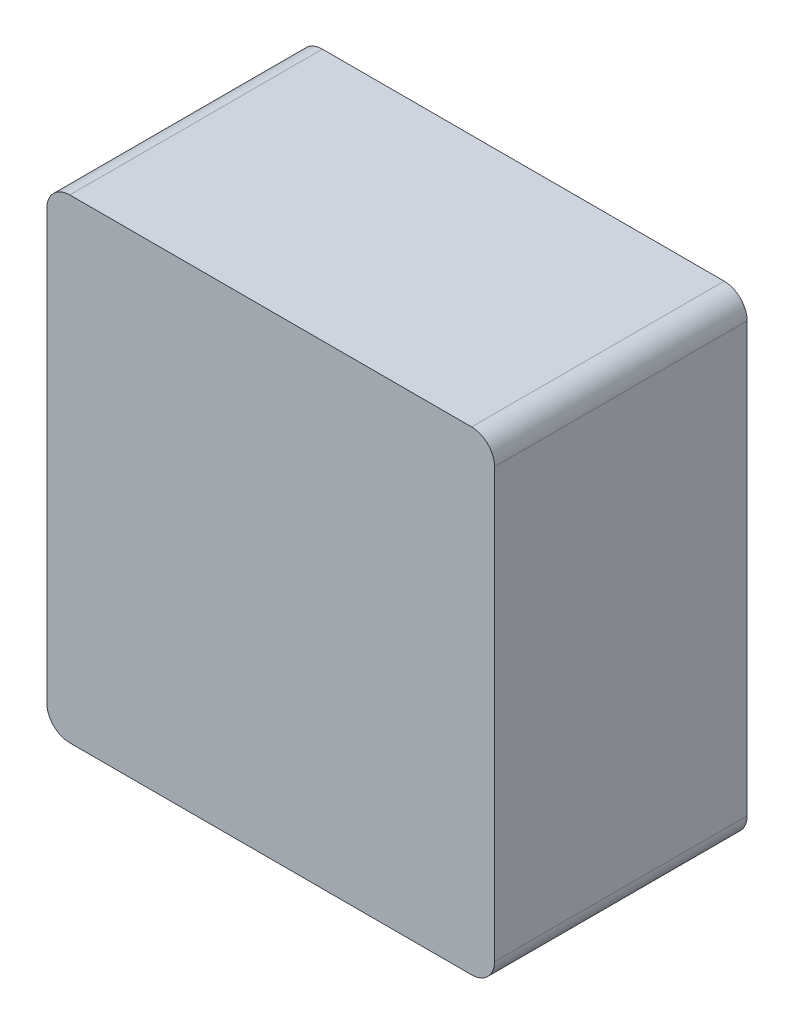
ISO-10303-21;
HEADER;
FILE_DESCRIPTION(('STEP AP214'),'2;1');
FILE_NAME('part.step','',(''),(''),'','','');
FILE_SCHEMA(('AUTOMOTIVE_DESIGN { 1 0 10303 214 1 1 1 1 }'));
ENDSEC;
DATA;
#1=APPLICATION_CONTEXT('core data for automotive mechanical design processes');
#2=APPLICATION_PROTOCOL_DEFINITION('international standard','automotive_design',2000,#1);
#3=PRODUCT_CONTEXT('',#1,'mechanical');
#4=PRODUCT('Part','Part','',(#3));
#5=PRODUCT_RELATED_PRODUCT_CATEGORY('part','',(#4));
#6=PRODUCT_DEFINITION_FORMATION('','',#4);
#7=PRODUCT_DEFINITION_CONTEXT('part definition',#1,'design');
#8=PRODUCT_DEFINITION('design','',#6,#7);
#9=PRODUCT_DEFINITION_SHAPE('','',#8);
#10=(LENGTH_UNIT() NAMED_UNIT(*) SI_UNIT(.MILLI.,.METRE.));
#11=(NAMED_UNIT(*) PLANE_ANGLE_UNIT() SI_UNIT($,.RADIAN.));
#12=(NAMED_UNIT(*) SI_UNIT($,.STERADIAN.) SOLID_ANGLE_UNIT());
#13=UNCERTAINTY_MEASURE_WITH_UNIT(LENGTH_MEASURE(1.E-05),#10,'distance_accuracy_value','');
#14=(GEOMETRIC_REPRESENTATION_CONTEXT(3) GLOBAL_UNCERTAINTY_ASSIGNED_CONTEXT((#13)) GLOBAL_UNIT_ASSIGNED_CONTEXT((#10,
#11,#12)) REPRESENTATION_CONTEXT('',''));
#15=CARTESIAN_POINT('',(0.,0.,0.));
#16=DIRECTION('',(0.,0.,1.));
#17=DIRECTION('',(1.,0.,0.));
#18=AXIS2_PLACEMENT_3D('',#15,#16,#17);
#19=CARTESIAN_POINT('',(26.25,-28.,-7.));
#20=DIRECTION('',(0.,0.,1.));
#21=DIRECTION('',(1.,0.,0.));
#22=AXIS2_PLACEMENT_3D('',#19,#20,#21);
#23=PLANE('',#22);
#24=CARTESIAN_POINT('',(26.25,-28.,-7.));
#25=DIRECTION('',(0.,0.,1.));
#26=DIRECTION('',(1.,0.,0.));
#27=AXIS2_PLACEMENT_3D('',#24,#25,#26);
#28=CIRCLE('',#27,3.);
#29=CARTESIAN_POINT('',(26.25,-31.,-7.));
#30=VERTEX_POINT('',#29);
#31=CARTESIAN_POINT('',(29.25,-28.,-7.));
#32=VERTEX_POINT('',#31);
#33=EDGE_CURVE('E143',#30,#32,#28,.T.);
#34=ORIENTED_EDGE('',*,*,#33,.F.);
#35=DIRECTION('',(1.,0.,0.));
#36=VECTOR('',#35,1.);
#37=CARTESIAN_POINT('',(-26.25,-31.,-7.));
#38=LINE('',#37,#36);
#39=CARTESIAN_POINT('',(-26.25,-31.,-7.));
#40=VERTEX_POINT('',#39);
#41=EDGE_CURVE('E212',#40,#30,#38,.T.);
#42=ORIENTED_EDGE('',*,*,#41,.F.);
#43=CARTESIAN_POINT('',(-26.25,-28.,-7.));
#44=DIRECTION('',(0.,0.,1.));
#45=DIRECTION('',(1.,0.,0.));
#46=AXIS2_PLACEMENT_3D('',#43,#44,#45);
#47=CIRCLE('',#46,3.);
#48=CARTESIAN_POINT('',(-29.25,-28.,-7.));
#49=VERTEX_POINT('',#48);
#50=EDGE_CURVE('E210',#49,#40,#47,.T.);
#51=ORIENTED_EDGE('',*,*,#50,.F.);
#52=DIRECTION('',(0.,-1.,0.));
#53=VECTOR('',#52,1.);
#54=CARTESIAN_POINT('',(-29.25,28.,-7.));
#55=LINE('',#54,#53);
#56=CARTESIAN_POINT('',(-29.25,28.,-7.));
#57=VERTEX_POINT('',#56);
#58=EDGE_CURVE('E208',#57,#49,#55,.T.);
#59=ORIENTED_EDGE('',*,*,#58,.F.);
#60=CARTESIAN_POINT('',(-26.25,28.,-7.));
#61=DIRECTION('',(0.,0.,1.));
#62=DIRECTION('',(1.,0.,0.));
#63=AXIS2_PLACEMENT_3D('',#60,#61,#62);
#64=CIRCLE('',#63,3.);
#65=CARTESIAN_POINT('',(-26.25,31.,-7.));
#66=VERTEX_POINT('',#65);
#67=EDGE_CURVE('E206',#66,#57,#64,.T.);
#68=ORIENTED_EDGE('',*,*,#67,.F.);
#69=DIRECTION('',(-1.,0.,0.));
#70=VECTOR('',#69,1.);
#71=CARTESIAN_POINT('',(26.25,31.,-7.));
#72=LINE('',#71,#70);
#73=CARTESIAN_POINT('',(26.25,31.,-7.));
#74=VERTEX_POINT('',#73);
#75=EDGE_CURVE('E204',#74,#66,#72,.T.);
#76=ORIENTED_EDGE('',*,*,#75,.F.);
#77=CARTESIAN_POINT('',(26.25,28.,-7.));
#78=DIRECTION('',(0.,0.,1.));
#79=DIRECTION('',(1.,0.,0.));
#80=AXIS2_PLACEMENT_3D('',#77,#78,#79);
#81=CIRCLE('',#80,3.);
#82=CARTESIAN_POINT('',(29.25,28.,-7.));
#83=VERTEX_POINT('',#82);
#84=EDGE_CURVE('E202',#83,#74,#81,.T.);
#85=ORIENTED_EDGE('',*,*,#84,.F.);
#86=DIRECTION('',(0.,1.,0.));
#87=VECTOR('',#86,1.);
#88=CARTESIAN_POINT('',(29.25,-28.,-7.));
#89=LINE('',#88,#87);
#90=EDGE_CURVE('E200',#32,#83,#89,.T.);
#91=ORIENTED_EDGE('',*,*,#90,.F.);
#92=EDGE_LOOP('',(#34,#42,#51,#59,#68,#76,#85,#91));
#93=FACE_BOUND('',#92,.T.);
#94=DIRECTION('',(-1.,0.,0.));
#95=VECTOR('',#94,1.);
#96=CARTESIAN_POINT('',(27.15,28.9,-7.));
#97=LINE('',#96,#95);
#98=CARTESIAN_POINT('',(27.15,28.9,-7.));
#99=VERTEX_POINT('',#98);
#100=CARTESIAN_POINT('',(-27.15,28.9,-7.));
#101=VERTEX_POINT('',#100);
#102=EDGE_CURVE('E179',#99,#101,#97,.T.);
#103=ORIENTED_EDGE('',*,*,#102,.T.);
#104=DIRECTION('',(0.,-1.,0.));
#105=VECTOR('',#104,1.);
#106=CARTESIAN_POINT('',(-27.15,28.9,-7.));
#107=LINE('',#106,#105);
#108=CARTESIAN_POINT('',(-27.15,-28.9,-7.));
#109=VERTEX_POINT('',#108);
#110=EDGE_CURVE('E182',#101,#109,#107,.T.);
#111=ORIENTED_EDGE('',*,*,#110,.T.);
#112=DIRECTION('',(1.,0.,0.));
#113=VECTOR('',#112,1.);
#114=CARTESIAN_POINT('',(-27.15,-28.9,-7.));
#115=LINE('',#114,#113);
#116=CARTESIAN_POINT('',(27.15,-28.9,-7.));
#117=VERTEX_POINT('',#116);
#118=EDGE_CURVE('E185',#109,#117,#115,.T.);
#119=ORIENTED_EDGE('',*,*,#118,.T.);
#120=DIRECTION('',(0.,1.,0.));
#121=VECTOR('',#120,1.);
#122=CARTESIAN_POINT('',(27.15,-28.9,-7.));
#123=LINE('',#122,#121);
#124=EDGE_CURVE('E188',#117,#99,#123,.T.);
#125=ORIENTED_EDGE('',*,*,#124,.T.);
#126=EDGE_LOOP('',(#103,#111,#119,#125));
#127=FACE_BOUND('',#126,.T.);
#128=ADVANCED_FACE('F33',(#93,#127),#23,.F.);
#129=CARTESIAN_POINT('',(26.25,-28.,23.));
#130=DIRECTION('',(0.,0.,-1.));
#131=DIRECTION('',(-1.,0.,0.));
#132=AXIS2_PLACEMENT_3D('',#129,#130,#131);
#133=CYLINDRICAL_SURFACE('',#132,3.);
#134=ORIENTED_EDGE('',*,*,#33,.T.);
#135=DIRECTION('',(0.,0.,-1.));
#136=VECTOR('',#135,1.);
#137=CARTESIAN_POINT('',(29.25,-28.,23.));
#138=LINE('',#137,#136);
#139=CARTESIAN_POINT('',(29.25,-28.,26.));
#140=VERTEX_POINT('',#139);
#141=EDGE_CURVE('E136',#140,#32,#138,.T.);
#142=ORIENTED_EDGE('',*,*,#141,.F.);
#143=CARTESIAN_POINT('',(26.25,-28.,26.));
#144=DIRECTION('',(0.,0.,1.));
#145=DIRECTION('',(1.,0.,0.));
#146=AXIS2_PLACEMENT_3D('',#143,#144,#145);
#147=CIRCLE('',#146,3.);
#148=CARTESIAN_POINT('',(26.25,-31.,26.));
#149=VERTEX_POINT('',#148);
#150=EDGE_CURVE('E141',#149,#140,#147,.T.);
#151=ORIENTED_EDGE('',*,*,#150,.F.);
#152=DIRECTION('',(0.,0.,-1.));
#153=VECTOR('',#152,1.);
#154=CARTESIAN_POINT('',(26.25,-31.,23.));
#155=LINE('',#154,#153);
#156=EDGE_CURVE('E214',#149,#30,#155,.T.);
#157=ORIENTED_EDGE('',*,*,#156,.T.);
#158=EDGE_LOOP('',(#134,#142,#151,#157));
#159=FACE_BOUND('',#158,.T.);
#160=ADVANCED_FACE('F138',(#159),#133,.T.);
#161=CARTESIAN_POINT('',(29.25,-28.,23.));
#162=DIRECTION('',(-1.,0.,0.));
#163=DIRECTION('',(0.,-1.,0.));
#164=AXIS2_PLACEMENT_3D('',#161,#162,#163);
#165=PLANE('',#164);
#166=ORIENTED_EDGE('',*,*,#90,.T.);
#167=DIRECTION('',(0.,0.,-1.));
#168=VECTOR('',#167,1.);
#169=CARTESIAN_POINT('',(29.25,28.,23.));
#170=LINE('',#169,#168);
#171=CARTESIAN_POINT('',(29.25,28.,26.));
#172=VERTEX_POINT('',#171);
#173=EDGE_CURVE('E146',#172,#83,#170,.T.);
#174=ORIENTED_EDGE('',*,*,#173,.F.);
#175=DIRECTION('',(0.,1.,0.));
#176=VECTOR('',#175,1.);
#177=CARTESIAN_POINT('',(29.25,-28.,26.));
#178=LINE('',#177,#176);
#179=EDGE_CURVE('E149',#140,#172,#178,.T.);
#180=ORIENTED_EDGE('',*,*,#179,.F.);
#181=ORIENTED_EDGE('',*,*,#141,.T.);
#182=EDGE_LOOP('',(#166,#174,#180,#181));
#183=FACE_BOUND('',#182,.T.);
#184=ADVANCED_FACE('F150',(#183),#165,.F.);
#185=CARTESIAN_POINT('',(26.25,28.,23.));
#186=DIRECTION('',(0.,0.,-1.));
#187=DIRECTION('',(-1.,0.,0.));
#188=AXIS2_PLACEMENT_3D('',#185,#186,#187);
#189=CYLINDRICAL_SURFACE('',#188,3.);
#190=ORIENTED_EDGE('',*,*,#84,.T.);
#191=DIRECTION('',(0.,0.,-1.));
#192=VECTOR('',#191,1.);
#193=CARTESIAN_POINT('',(26.25,31.,23.));
#194=LINE('',#193,#192);
#195=CARTESIAN_POINT('',(26.25,31.,26.));
#196=VERTEX_POINT('',#195);
#197=EDGE_CURVE('E228',#196,#74,#194,.T.);
#198=ORIENTED_EDGE('',*,*,#197,.F.);
#199=CARTESIAN_POINT('',(26.25,28.,26.));
#200=DIRECTION('',(0.,0.,1.));
#201=DIRECTION('',(1.,0.,0.));
#202=AXIS2_PLACEMENT_3D('',#199,#200,#201);
#203=CIRCLE('',#202,3.);
#204=EDGE_CURVE('E155',#172,#196,#203,.T.);
#205=ORIENTED_EDGE('',*,*,#204,.F.);
#206=ORIENTED_EDGE('',*,*,#173,.T.);
#207=EDGE_LOOP('',(#190,#198,#205,#206));
#208=FACE_BOUND('',#207,.T.);
#209=ADVANCED_FACE('F314',(#208),#189,.T.);
#210=CARTESIAN_POINT('',(26.25,31.,23.));
#211=DIRECTION('',(0.,-1.,0.));
#212=DIRECTION('',(0.,0.,-1.));
#213=AXIS2_PLACEMENT_3D('',#210,#211,#212);
#214=PLANE('',#213);
#215=ORIENTED_EDGE('',*,*,#75,.T.);
#216=DIRECTION('',(0.,0.,-1.));
#217=VECTOR('',#216,1.);
#218=CARTESIAN_POINT('',(-26.25,31.,23.));
#219=LINE('',#218,#217);
#220=CARTESIAN_POINT('',(-26.25,31.,26.));
#221=VERTEX_POINT('',#220);
#222=EDGE_CURVE('E225',#221,#66,#219,.T.);
#223=ORIENTED_EDGE('',*,*,#222,.F.);
#224=DIRECTION('',(-1.,0.,0.));
#225=VECTOR('',#224,1.);
#226=CARTESIAN_POINT('',(26.25,31.,26.));
#227=LINE('',#226,#225);
#228=EDGE_CURVE('E167',#196,#221,#227,.T.);
#229=ORIENTED_EDGE('',*,*,#228,.F.);
#230=ORIENTED_EDGE('',*,*,#197,.T.);
#231=EDGE_LOOP('',(#215,#223,#229,#230));
#232=FACE_BOUND('',#231,.T.);
#233=ADVANCED_FACE('F310',(#232),#214,.F.);
#234=CARTESIAN_POINT('',(-26.25,28.,23.));
#235=DIRECTION('',(0.,0.,-1.));
#236=DIRECTION('',(-1.,0.,0.));
#237=AXIS2_PLACEMENT_3D('',#234,#235,#236);
#238=CYLINDRICAL_SURFACE('',#237,3.);
#239=ORIENTED_EDGE('',*,*,#67,.T.);
#240=DIRECTION('',(0.,0.,-1.));
#241=VECTOR('',#240,1.);
#242=CARTESIAN_POINT('',(-29.25,28.,23.));
#243=LINE('',#242,#241);
#244=CARTESIAN_POINT('',(-29.25,28.,26.));
#245=VERTEX_POINT('',#244);
#246=EDGE_CURVE('E222',#245,#57,#243,.T.);
#247=ORIENTED_EDGE('',*,*,#246,.F.);
#248=CARTESIAN_POINT('',(-26.25,28.,26.));
#249=DIRECTION('',(0.,0.,1.));
#250=DIRECTION('',(1.,0.,0.));
#251=AXIS2_PLACEMENT_3D('',#248,#249,#250);
#252=CIRCLE('',#251,3.);
#253=EDGE_CURVE('E170',#221,#245,#252,.T.);
#254=ORIENTED_EDGE('',*,*,#253,.F.);
#255=ORIENTED_EDGE('',*,*,#222,.T.);
#256=EDGE_LOOP('',(#239,#247,#254,#255));
#257=FACE_BOUND('',#256,.T.);
#258=ADVANCED_FACE('F306',(#257),#238,.T.);
#259=CARTESIAN_POINT('',(-29.25,28.,23.));
#260=DIRECTION('',(1.,0.,0.));
#261=DIRECTION('',(0.,1.,0.));
#262=AXIS2_PLACEMENT_3D('',#259,#260,#261);
#263=PLANE('',#262);
#264=ORIENTED_EDGE('',*,*,#58,.T.);
#265=DIRECTION('',(0.,0.,-1.));
#266=VECTOR('',#265,1.);
#267=CARTESIAN_POINT('',(-29.25,-28.,23.));
#268=LINE('',#267,#266);
#269=CARTESIAN_POINT('',(-29.25,-28.,26.));
#270=VERTEX_POINT('',#269);
#271=EDGE_CURVE('E219',#270,#49,#268,.T.);
#272=ORIENTED_EDGE('',*,*,#271,.F.);
#273=DIRECTION('',(0.,-1.,0.));
#274=VECTOR('',#273,1.);
#275=CARTESIAN_POINT('',(-29.25,28.,26.));
#276=LINE('',#275,#274);
#277=EDGE_CURVE('E173',#245,#270,#276,.T.);
#278=ORIENTED_EDGE('',*,*,#277,.F.);
#279=ORIENTED_EDGE('',*,*,#246,.T.);
#280=EDGE_LOOP('',(#264,#272,#278,#279));
#281=FACE_BOUND('',#280,.T.);
#282=ADVANCED_FACE('F302',(#281),#263,.F.);
#283=CARTESIAN_POINT('',(-26.25,-28.,23.));
#284=DIRECTION('',(0.,0.,-1.));
#285=DIRECTION('',(-1.,0.,0.));
#286=AXIS2_PLACEMENT_3D('',#283,#284,#285);
#287=CYLINDRICAL_SURFACE('',#286,3.);
#288=ORIENTED_EDGE('',*,*,#50,.T.);
#289=DIRECTION('',(0.,0.,-1.));
#290=VECTOR('',#289,1.);
#291=CARTESIAN_POINT('',(-26.25,-31.,23.));
#292=LINE('',#291,#290);
#293=CARTESIAN_POINT('',(-26.25,-31.,26.));
#294=VERTEX_POINT('',#293);
#295=EDGE_CURVE('E216',#294,#40,#292,.T.);
#296=ORIENTED_EDGE('',*,*,#295,.F.);
#297=CARTESIAN_POINT('',(-26.25,-28.,26.));
#298=DIRECTION('',(0.,0.,1.));
#299=DIRECTION('',(1.,0.,0.));
#300=AXIS2_PLACEMENT_3D('',#297,#298,#299);
#301=CIRCLE('',#300,3.);
#302=EDGE_CURVE('E176',#270,#294,#301,.T.);
#303=ORIENTED_EDGE('',*,*,#302,.F.);
#304=ORIENTED_EDGE('',*,*,#271,.T.);
#305=EDGE_LOOP('',(#288,#296,#303,#304));
#306=FACE_BOUND('',#305,.T.);
#307=ADVANCED_FACE('F298',(#306),#287,.T.);
#308=CARTESIAN_POINT('',(-26.25,-31.,23.));
#309=DIRECTION('',(0.,1.,0.));
#310=DIRECTION('',(0.,0.,1.));
#311=AXIS2_PLACEMENT_3D('',#308,#309,#310);
#312=PLANE('',#311);
#313=ORIENTED_EDGE('',*,*,#41,.T.);
#314=ORIENTED_EDGE('',*,*,#156,.F.);
#315=DIRECTION('',(1.,0.,0.));
#316=VECTOR('',#315,1.);
#317=CARTESIAN_POINT('',(-26.25,-31.,26.));
#318=LINE('',#317,#316);
#319=EDGE_CURVE('E161',#294,#149,#318,.T.);
#320=ORIENTED_EDGE('',*,*,#319,.F.);
#321=ORIENTED_EDGE('',*,*,#295,.T.);
#322=EDGE_LOOP('',(#313,#314,#320,#321));
#323=FACE_BOUND('',#322,.T.);
#324=ADVANCED_FACE('F295',(#323),#312,.F.);
#325=CARTESIAN_POINT('',(27.15,28.9,23.));
#326=DIRECTION('',(0.,-1.,0.));
#327=DIRECTION('',(0.,0.,-1.));
#328=AXIS2_PLACEMENT_3D('',#325,#326,#327);
#329=PLANE('',#328);
#330=DIRECTION('',(0.,0.,-1.));
#331=VECTOR('',#330,1.);
#332=CARTESIAN_POINT('',(27.15,28.9,23.));
#333=LINE('',#332,#331);
#334=CARTESIAN_POINT('',(27.15,28.9,20.5));
#335=VERTEX_POINT('',#334);
#336=EDGE_CURVE('E191',#335,#99,#333,.T.);
#337=ORIENTED_EDGE('',*,*,#336,.F.);
#338=DIRECTION('',(-1.,0.,0.));
#339=VECTOR('',#338,1.);
#340=CARTESIAN_POINT('',(27.15,28.9,20.5));
#341=LINE('',#340,#339);
#342=CARTESIAN_POINT('',(-27.15,28.9,20.5));
#343=VERTEX_POINT('',#342);
#344=EDGE_CURVE('E42',#335,#343,#341,.T.);
#345=ORIENTED_EDGE('',*,*,#344,.T.);
#346=DIRECTION('',(0.,0.,-1.));
#347=VECTOR('',#346,1.);
#348=CARTESIAN_POINT('',(-27.15,28.9,23.));
#349=LINE('',#348,#347);
#350=EDGE_CURVE('E197',#343,#101,#349,.T.);
#351=ORIENTED_EDGE('',*,*,#350,.T.);
#352=ORIENTED_EDGE('',*,*,#102,.F.);
#353=EDGE_LOOP('',(#337,#345,#351,#352));
#354=FACE_BOUND('',#353,.T.);
#355=ADVANCED_FACE('F273',(#354),#329,.T.);
#356=CARTESIAN_POINT('',(-27.15,28.9,23.));
#357=DIRECTION('',(1.,0.,0.));
#358=DIRECTION('',(0.,1.,0.));
#359=AXIS2_PLACEMENT_3D('',#356,#357,#358);
#360=PLANE('',#359);
#361=ORIENTED_EDGE('',*,*,#350,.F.);
#362=DIRECTION('',(0.,-1.,0.));
#363=VECTOR('',#362,1.);
#364=CARTESIAN_POINT('',(-27.15,28.9,20.5));
#365=LINE('',#364,#363);
#366=CARTESIAN_POINT('',(-27.15,-28.9,20.5));
#367=VERTEX_POINT('',#366);
#368=EDGE_CURVE('E11',#343,#367,#365,.T.);
#369=ORIENTED_EDGE('',*,*,#368,.T.);
#370=DIRECTION('',(0.,0.,-1.));
#371=VECTOR('',#370,1.);
#372=CARTESIAN_POINT('',(-27.15,-28.9,23.));
#373=LINE('',#372,#371);
#374=EDGE_CURVE('E195',#367,#109,#373,.T.);
#375=ORIENTED_EDGE('',*,*,#374,.T.);
#376=ORIENTED_EDGE('',*,*,#110,.F.);
#377=EDGE_LOOP('',(#361,#369,#375,#376));
#378=FACE_BOUND('',#377,.T.);
#379=ADVANCED_FACE('F265',(#378),#360,.T.);
#380=CARTESIAN_POINT('',(-27.15,-28.9,23.));
#381=DIRECTION('',(0.,1.,0.));
#382=DIRECTION('',(0.,0.,1.));
#383=AXIS2_PLACEMENT_3D('',#380,#381,#382);
#384=PLANE('',#383);
#385=ORIENTED_EDGE('',*,*,#374,.F.);
#386=DIRECTION('',(1.,0.,0.));
#387=VECTOR('',#386,1.);
#388=CARTESIAN_POINT('',(-27.15,-28.9,20.5));
#389=LINE('',#388,#387);
#390=CARTESIAN_POINT('',(27.15,-28.9,20.5));
#391=VERTEX_POINT('',#390);
#392=EDGE_CURVE('E145',#367,#391,#389,.T.);
#393=ORIENTED_EDGE('',*,*,#392,.T.);
#394=DIRECTION('',(0.,0.,-1.));
#395=VECTOR('',#394,1.);
#396=CARTESIAN_POINT('',(27.15,-28.9,23.));
#397=LINE('',#396,#395);
#398=EDGE_CURVE('E193',#391,#117,#397,.T.);
#399=ORIENTED_EDGE('',*,*,#398,.T.);
#400=ORIENTED_EDGE('',*,*,#118,.F.);
#401=EDGE_LOOP('',(#385,#393,#399,#400));
#402=FACE_BOUND('',#401,.T.);
#403=ADVANCED_FACE('F269',(#402),#384,.T.);
#404=CARTESIAN_POINT('',(27.15,-28.9,23.));
#405=DIRECTION('',(-1.,0.,0.));
#406=DIRECTION('',(0.,-1.,0.));
#407=AXIS2_PLACEMENT_3D('',#404,#405,#406);
#408=PLANE('',#407);
#409=ORIENTED_EDGE('',*,*,#398,.F.);
#410=DIRECTION('',(0.,1.,0.));
#411=VECTOR('',#410,1.);
#412=CARTESIAN_POINT('',(27.15,-28.9,20.5));
#413=LINE('',#412,#411);
#414=EDGE_CURVE('E57',#391,#335,#413,.T.);
#415=ORIENTED_EDGE('',*,*,#414,.T.);
#416=ORIENTED_EDGE('',*,*,#336,.T.);
#417=ORIENTED_EDGE('',*,*,#124,.F.);
#418=EDGE_LOOP('',(#409,#415,#416,#417));
#419=FACE_BOUND('',#418,.T.);
#420=ADVANCED_FACE('F274',(#419),#408,.T.);
#421=CARTESIAN_POINT('',(26.25,-28.,23.));
#422=DIRECTION('',(0.,0.,1.));
#423=DIRECTION('',(1.,0.,0.));
#424=AXIS2_PLACEMENT_3D('',#421,#422,#423);
#425=PLANE('',#424);
#426=DIRECTION('',(0.,1.,0.));
#427=VECTOR('',#426,1.);
#428=CARTESIAN_POINT('',(24.65,-28.,23.));
#429=LINE('',#428,#427);
#430=CARTESIAN_POINT('',(24.65,26.4,23.));
#431=VERTEX_POINT('',#430);
#432=CARTESIAN_POINT('',(24.65,-26.4,23.));
#433=VERTEX_POINT('',#432);
#434=EDGE_CURVE('E238',#431,#433,#429,.F.);
#435=ORIENTED_EDGE('',*,*,#434,.T.);
#436=DIRECTION('',(1.,0.,0.));
#437=VECTOR('',#436,1.);
#438=CARTESIAN_POINT('',(26.25,-26.4,23.));
#439=LINE('',#438,#437);
#440=CARTESIAN_POINT('',(-24.65,-26.4,23.));
#441=VERTEX_POINT('',#440);
#442=EDGE_CURVE('E240',#433,#441,#439,.F.);
#443=ORIENTED_EDGE('',*,*,#442,.T.);
#444=DIRECTION('',(0.,-1.,0.));
#445=VECTOR('',#444,1.);
#446=CARTESIAN_POINT('',(-24.65,-28.,23.));
#447=LINE('',#446,#445);
#448=CARTESIAN_POINT('',(-24.65,26.4,23.));
#449=VERTEX_POINT('',#448);
#450=EDGE_CURVE('E234',#441,#449,#447,.F.);
#451=ORIENTED_EDGE('',*,*,#450,.T.);
#452=DIRECTION('',(-1.,0.,0.));
#453=VECTOR('',#452,1.);
#454=CARTESIAN_POINT('',(26.25,26.4,23.));
#455=LINE('',#454,#453);
#456=EDGE_CURVE('E236',#449,#431,#455,.F.);
#457=ORIENTED_EDGE('',*,*,#456,.T.);
#458=EDGE_LOOP('',(#435,#443,#451,#457));
#459=FACE_BOUND('',#458,.T.);
#460=ADVANCED_FACE('F276',(#459),#425,.F.);
#461=CARTESIAN_POINT('',(26.25,-28.,26.));
#462=DIRECTION('',(0.,0.,1.));
#463=DIRECTION('',(1.,0.,0.));
#464=AXIS2_PLACEMENT_3D('',#461,#462,#463);
#465=PLANE('',#464);
#466=ORIENTED_EDGE('',*,*,#150,.T.);
#467=ORIENTED_EDGE('',*,*,#179,.T.);
#468=ORIENTED_EDGE('',*,*,#204,.T.);
#469=ORIENTED_EDGE('',*,*,#228,.T.);
#470=ORIENTED_EDGE('',*,*,#253,.T.);
#471=ORIENTED_EDGE('',*,*,#277,.T.);
#472=ORIENTED_EDGE('',*,*,#302,.T.);
#473=ORIENTED_EDGE('',*,*,#319,.T.);
#474=EDGE_LOOP('',(#466,#467,#468,#469,#470,#471,#472,#473));
#475=FACE_BOUND('',#474,.T.);
#476=ADVANCED_FACE('F158',(#475),#465,.T.);
#477=CARTESIAN_POINT('',(27.15,26.4,20.5));
#478=DIRECTION('',(-1.,0.,0.));
#479=DIRECTION('',(0.,0.,1.));
#480=AXIS2_PLACEMENT_3D('',#477,#478,#479);
#481=CYLINDRICAL_SURFACE('',#480,2.5);
#482=CARTESIAN_POINT('',(24.65,26.4,20.5));
#483=DIRECTION('',(-0.707106781186548,0.707106781186547,0.));
#484=DIRECTION('',(0.707106781186547,0.707106781186548,0.));
#485=AXIS2_PLACEMENT_3D('',#482,#483,#484);
#486=ELLIPSE('',#485,3.53553390593274,2.5);
#487=EDGE_CURVE('E164',#431,#335,#486,.T.);
#488=ORIENTED_EDGE('',*,*,#487,.F.);
#489=ORIENTED_EDGE('',*,*,#456,.F.);
#490=CARTESIAN_POINT('',(-24.65,26.4,20.5));
#491=DIRECTION('',(-0.707106781186547,-0.707106781186548,0.));
#492=DIRECTION('',(-0.707106781186548,0.707106781186547,0.));
#493=AXIS2_PLACEMENT_3D('',#490,#491,#492);
#494=ELLIPSE('',#493,3.53553390593274,2.5);
#495=EDGE_CURVE('E37',#343,#449,#494,.F.);
#496=ORIENTED_EDGE('',*,*,#495,.F.);
#497=ORIENTED_EDGE('',*,*,#344,.F.);
#498=EDGE_LOOP('',(#488,#489,#496,#497));
#499=FACE_BOUND('',#498,.T.);
#500=ADVANCED_FACE('F35',(#499),#481,.F.);
#501=CARTESIAN_POINT('',(-24.65,28.9,20.5));
#502=DIRECTION('',(0.,-1.,0.));
#503=DIRECTION('',(1.,0.,0.));
#504=AXIS2_PLACEMENT_3D('',#501,#502,#503);
#505=CYLINDRICAL_SURFACE('',#504,2.5);
#506=ORIENTED_EDGE('',*,*,#495,.T.);
#507=ORIENTED_EDGE('',*,*,#450,.F.);
#508=CARTESIAN_POINT('',(-24.65,-26.4,20.5));
#509=DIRECTION('',(0.707106781186548,-0.707106781186547,0.));
#510=DIRECTION('',(0.707106781186547,0.707106781186548,0.));
#511=AXIS2_PLACEMENT_3D('',#508,#509,#510);
#512=ELLIPSE('',#511,3.53553390593274,2.5);
#513=EDGE_CURVE('E247',#367,#441,#512,.F.);
#514=ORIENTED_EDGE('',*,*,#513,.F.);
#515=ORIENTED_EDGE('',*,*,#368,.F.);
#516=EDGE_LOOP('',(#506,#507,#514,#515));
#517=FACE_BOUND('',#516,.T.);
#518=ADVANCED_FACE('F261',(#517),#505,.F.);
#519=CARTESIAN_POINT('',(24.65,-28.9,20.5));
#520=DIRECTION('',(0.,1.,0.));
#521=DIRECTION('',(-1.,0.,0.));
#522=AXIS2_PLACEMENT_3D('',#519,#520,#521);
#523=CYLINDRICAL_SURFACE('',#522,2.5);
#524=ORIENTED_EDGE('',*,*,#487,.T.);
#525=ORIENTED_EDGE('',*,*,#414,.F.);
#526=CARTESIAN_POINT('',(24.65,-26.4,20.5));
#527=DIRECTION('',(0.707106781186547,0.707106781186548,0.));
#528=DIRECTION('',(0.707106781186548,-0.707106781186547,0.));
#529=AXIS2_PLACEMENT_3D('',#526,#527,#528);
#530=ELLIPSE('',#529,3.53553390593274,2.5);
#531=EDGE_CURVE('E245',#433,#391,#530,.T.);
#532=ORIENTED_EDGE('',*,*,#531,.F.);
#533=ORIENTED_EDGE('',*,*,#434,.F.);
#534=EDGE_LOOP('',(#524,#525,#532,#533));
#535=FACE_BOUND('',#534,.T.);
#536=ADVANCED_FACE('F252',(#535),#523,.F.);
#537=CARTESIAN_POINT('',(-27.15,-26.4,20.5));
#538=DIRECTION('',(1.,0.,0.));
#539=DIRECTION('',(0.,0.,-1.));
#540=AXIS2_PLACEMENT_3D('',#537,#538,#539);
#541=CYLINDRICAL_SURFACE('',#540,2.5);
#542=ORIENTED_EDGE('',*,*,#513,.T.);
#543=ORIENTED_EDGE('',*,*,#442,.F.);
#544=ORIENTED_EDGE('',*,*,#531,.T.);
#545=ORIENTED_EDGE('',*,*,#392,.F.);
#546=EDGE_LOOP('',(#542,#543,#544,#545));
#547=FACE_BOUND('',#546,.T.);
#548=ADVANCED_FACE('F321',(#547),#541,.F.);
#549=CLOSED_SHELL('',(#128,#160,#184,#209,#233,#258,#282,#307,#324,#355,#379,#403,#420,#460,
#476,#500,#518,#536,#548));
#550=MANIFOLD_SOLID_BREP('B2',#549);
#551=ADVANCED_BREP_SHAPE_REPRESENTATION('',(#18,#550),#14);
#552=SHAPE_DEFINITION_REPRESENTATION(#9,#551);
ENDSEC;
END-ISO-10303-21;
